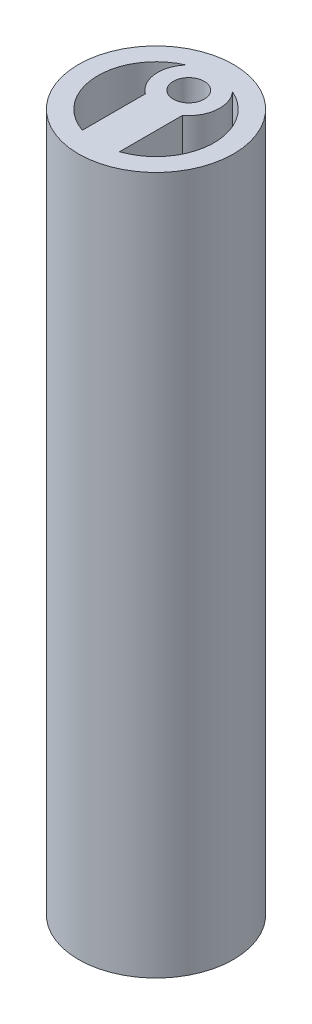
ISO-10303-21;
HEADER;
FILE_DESCRIPTION(('STEP AP214'),'2;1');
FILE_NAME('part.step','',(''),(''),'','','');
FILE_SCHEMA(('AUTOMOTIVE_DESIGN { 1 0 10303 214 1 1 1 1 }'));
ENDSEC;
DATA;
#1=APPLICATION_CONTEXT('core data for automotive mechanical design processes');
#2=APPLICATION_PROTOCOL_DEFINITION('international standard','automotive_design',2000,#1);
#3=PRODUCT_CONTEXT('',#1,'mechanical');
#4=PRODUCT('Part','Part','',(#3));
#5=PRODUCT_RELATED_PRODUCT_CATEGORY('part','',(#4));
#6=PRODUCT_DEFINITION_FORMATION('','',#4);
#7=PRODUCT_DEFINITION_CONTEXT('part definition',#1,'design');
#8=PRODUCT_DEFINITION('design','',#6,#7);
#9=PRODUCT_DEFINITION_SHAPE('','',#8);
#10=(LENGTH_UNIT() NAMED_UNIT(*) SI_UNIT(.MILLI.,.METRE.));
#11=(NAMED_UNIT(*) PLANE_ANGLE_UNIT() SI_UNIT($,.RADIAN.));
#12=(NAMED_UNIT(*) SI_UNIT($,.STERADIAN.) SOLID_ANGLE_UNIT());
#13=UNCERTAINTY_MEASURE_WITH_UNIT(LENGTH_MEASURE(1.E-05),#10,'distance_accuracy_value','');
#14=(GEOMETRIC_REPRESENTATION_CONTEXT(3) GLOBAL_UNCERTAINTY_ASSIGNED_CONTEXT((#13)) GLOBAL_UNIT_ASSIGNED_CONTEXT((#10,
#11,#12)) REPRESENTATION_CONTEXT('',''));
#15=CARTESIAN_POINT('',(0.,0.,0.));
#16=DIRECTION('',(0.,0.,1.));
#17=DIRECTION('',(1.,0.,0.));
#18=AXIS2_PLACEMENT_3D('',#15,#16,#17);
#19=CARTESIAN_POINT('',(0.,45.,0.));
#20=DIRECTION('',(0.,-1.,0.));
#21=DIRECTION('',(0.,0.,-1.));
#22=AXIS2_PLACEMENT_3D('',#19,#20,#21);
#23=CYLINDRICAL_SURFACE('',#22,3.75);
#24=DIRECTION('',(0.,1.,0.));
#25=VECTOR('',#24,1.);
#26=CARTESIAN_POINT('',(-1.49902151913111,22.5,-3.43735864948391));
#27=LINE('',#26,#25);
#28=CARTESIAN_POINT('',(-1.49902151913111,45.,-3.43735864948391));
#29=VERTEX_POINT('',#28);
#30=CARTESIAN_POINT('',(-1.49902151913111,0.,-3.43735864948391));
#31=VERTEX_POINT('',#30);
#32=EDGE_CURVE('E118',#29,#31,#27,.F.);
#33=ORIENTED_EDGE('',*,*,#32,.F.);
#34=CARTESIAN_POINT('',(0.,45.,0.));
#35=DIRECTION('',(0.,1.,0.));
#36=DIRECTION('',(0.,0.,1.));
#37=AXIS2_PLACEMENT_3D('',#34,#35,#36);
#38=CIRCLE('',#37,3.75);
#39=CARTESIAN_POINT('',(-1.2,45.,3.5528157846981));
#40=VERTEX_POINT('',#39);
#41=EDGE_CURVE('E124',#29,#40,#38,.T.);
#42=ORIENTED_EDGE('',*,*,#41,.T.);
#43=DIRECTION('',(0.,-1.,0.));
#44=VECTOR('',#43,1.);
#45=CARTESIAN_POINT('',(-1.2,45.,3.5528157846981));
#46=LINE('',#45,#44);
#47=CARTESIAN_POINT('',(-1.2,0.,3.5528157846981));
#48=VERTEX_POINT('',#47);
#49=EDGE_CURVE('E45',#48,#40,#46,.F.);
#50=ORIENTED_EDGE('',*,*,#49,.F.);
#51=CARTESIAN_POINT('',(0.,0.,0.));
#52=DIRECTION('',(0.,1.,0.));
#53=DIRECTION('',(0.,0.,1.));
#54=AXIS2_PLACEMENT_3D('',#51,#52,#53);
#55=CIRCLE('',#54,3.75);
#56=EDGE_CURVE('E60',#31,#48,#55,.T.);
#57=ORIENTED_EDGE('',*,*,#56,.F.);
#58=EDGE_LOOP('',(#33,#42,#50,#57));
#59=FACE_BOUND('',#58,.T.);
#60=ADVANCED_FACE('F37',(#59),#23,.F.);
#61=CARTESIAN_POINT('',(0.,45.,0.));
#62=DIRECTION('',(0.,1.,0.));
#63=DIRECTION('',(0.,0.,1.));
#64=AXIS2_PLACEMENT_3D('',#61,#62,#63);
#65=PLANE('',#64);
#66=CARTESIAN_POINT('',(0.,45.,-2.11337432737815));
#67=DIRECTION('',(0.,1.,0.));
#68=DIRECTION('',(0.,0.,1.));
#69=AXIS2_PLACEMENT_3D('',#66,#67,#68);
#70=CIRCLE('',#69,1.);
#71=CARTESIAN_POINT('',(0.,45.,-1.11337432737815));
#72=VERTEX_POINT('',#71);
#73=EDGE_CURVE('E176',#72,#72,#70,.T.);
#74=ORIENTED_EDGE('',*,*,#73,.F.);
#75=EDGE_LOOP('',(#74));
#76=FACE_BOUND('',#75,.T.);
#77=ORIENTED_EDGE('',*,*,#41,.F.);
#78=CARTESIAN_POINT('',(0.,45.,-2.11337432737815));
#79=DIRECTION('',(0.,1.,0.));
#80=DIRECTION('',(0.,0.,1.));
#81=AXIS2_PLACEMENT_3D('',#78,#79,#80);
#82=CIRCLE('',#81,2.);
#83=CARTESIAN_POINT('',(-1.2,45.,-0.513374327378152));
#84=VERTEX_POINT('',#83);
#85=EDGE_CURVE('E52',#29,#84,#82,.T.);
#86=ORIENTED_EDGE('',*,*,#85,.T.);
#87=DIRECTION('',(0.,0.,1.));
#88=VECTOR('',#87,1.);
#89=CARTESIAN_POINT('',(-1.2,45.,-4.35622350307341));
#90=LINE('',#89,#88);
#91=EDGE_CURVE('E115',#84,#40,#90,.T.);
#92=ORIENTED_EDGE('',*,*,#91,.T.);
#93=EDGE_LOOP('',(#77,#86,#92));
#94=FACE_BOUND('',#93,.T.);
#95=CARTESIAN_POINT('',(1.2,45.,-0.513374327378149));
#96=VERTEX_POINT('',#95);
#97=CARTESIAN_POINT('',(1.49902151913111,45.,-3.43735864948391));
#98=VERTEX_POINT('',#97);
#99=EDGE_CURVE('E91',#96,#98,#82,.T.);
#100=ORIENTED_EDGE('',*,*,#99,.T.);
#101=CARTESIAN_POINT('',(1.2,45.,3.5528157846981));
#102=VERTEX_POINT('',#101);
#103=EDGE_CURVE('E112',#102,#98,#38,.T.);
#104=ORIENTED_EDGE('',*,*,#103,.F.);
#105=DIRECTION('',(0.,0.,-1.));
#106=VECTOR('',#105,1.);
#107=CARTESIAN_POINT('',(1.2,45.,-4.35622350307341));
#108=LINE('',#107,#106);
#109=EDGE_CURVE('E107',#102,#96,#108,.T.);
#110=ORIENTED_EDGE('',*,*,#109,.T.);
#111=EDGE_LOOP('',(#100,#104,#110));
#112=FACE_BOUND('',#111,.T.);
#113=CARTESIAN_POINT('',(0.,45.,0.));
#114=DIRECTION('',(0.,1.,0.));
#115=DIRECTION('',(0.,0.,1.));
#116=AXIS2_PLACEMENT_3D('',#113,#114,#115);
#117=CIRCLE('',#116,5.);
#118=CARTESIAN_POINT('',(0.,45.,-5.));
#119=VERTEX_POINT('',#118);
#120=EDGE_CURVE('E128',#119,#119,#117,.T.);
#121=ORIENTED_EDGE('',*,*,#120,.T.);
#122=EDGE_LOOP('',(#121));
#123=FACE_BOUND('',#122,.T.);
#124=ADVANCED_FACE('F110',(#76,#94,#112,#123),#65,.T.);
#125=CARTESIAN_POINT('',(0.,0.,0.));
#126=DIRECTION('',(0.,1.,0.));
#127=DIRECTION('',(0.,0.,1.));
#128=AXIS2_PLACEMENT_3D('',#125,#126,#127);
#129=PLANE('',#128);
#130=CARTESIAN_POINT('',(0.,0.,-2.11337432737815));
#131=DIRECTION('',(0.,1.,0.));
#132=DIRECTION('',(0.,0.,1.));
#133=AXIS2_PLACEMENT_3D('',#130,#131,#132);
#134=CIRCLE('',#133,1.);
#135=CARTESIAN_POINT('',(0.,0.,-1.11337432737815));
#136=VERTEX_POINT('',#135);
#137=EDGE_CURVE('E174',#136,#136,#134,.T.);
#138=ORIENTED_EDGE('',*,*,#137,.T.);
#139=EDGE_LOOP('',(#138));
#140=FACE_BOUND('',#139,.T.);
#141=CARTESIAN_POINT('',(0.,0.,-2.11337432737815));
#142=DIRECTION('',(0.,1.,0.));
#143=DIRECTION('',(0.,0.,1.));
#144=AXIS2_PLACEMENT_3D('',#141,#142,#143);
#145=CIRCLE('',#144,2.);
#146=CARTESIAN_POINT('',(-1.2,0.,-0.513374327378152));
#147=VERTEX_POINT('',#146);
#148=EDGE_CURVE('E100',#31,#147,#145,.T.);
#149=ORIENTED_EDGE('',*,*,#148,.F.);
#150=ORIENTED_EDGE('',*,*,#56,.T.);
#151=DIRECTION('',(0.,0.,1.));
#152=VECTOR('',#151,1.);
#153=CARTESIAN_POINT('',(-1.2,0.,-4.35622350307341));
#154=LINE('',#153,#152);
#155=EDGE_CURVE('E114',#147,#48,#154,.T.);
#156=ORIENTED_EDGE('',*,*,#155,.F.);
#157=EDGE_LOOP('',(#149,#150,#156));
#158=FACE_BOUND('',#157,.T.);
#159=CARTESIAN_POINT('',(1.2,0.,3.5528157846981));
#160=VERTEX_POINT('',#159);
#161=CARTESIAN_POINT('',(1.49902151913111,0.,-3.43735864948391));
#162=VERTEX_POINT('',#161);
#163=EDGE_CURVE('E125',#160,#162,#55,.T.);
#164=ORIENTED_EDGE('',*,*,#163,.T.);
#165=CARTESIAN_POINT('',(1.2,0.,-0.513374327378149));
#166=VERTEX_POINT('',#165);
#167=EDGE_CURVE('E180',#166,#162,#145,.T.);
#168=ORIENTED_EDGE('',*,*,#167,.F.);
#169=DIRECTION('',(0.,0.,-1.));
#170=VECTOR('',#169,1.);
#171=CARTESIAN_POINT('',(1.2,0.,-4.35622350307341));
#172=LINE('',#171,#170);
#173=EDGE_CURVE('E109',#160,#166,#172,.T.);
#174=ORIENTED_EDGE('',*,*,#173,.F.);
#175=EDGE_LOOP('',(#164,#168,#174));
#176=FACE_BOUND('',#175,.T.);
#177=CARTESIAN_POINT('',(0.,0.,0.));
#178=DIRECTION('',(0.,1.,0.));
#179=DIRECTION('',(0.,0.,1.));
#180=AXIS2_PLACEMENT_3D('',#177,#178,#179);
#181=CIRCLE('',#180,5.);
#182=CARTESIAN_POINT('',(0.,0.,-5.));
#183=VERTEX_POINT('',#182);
#184=EDGE_CURVE('E123',#183,#183,#181,.T.);
#185=ORIENTED_EDGE('',*,*,#184,.F.);
#186=EDGE_LOOP('',(#185));
#187=FACE_BOUND('',#186,.T.);
#188=ADVANCED_FACE('F143',(#140,#158,#176,#187),#129,.F.);
#189=CARTESIAN_POINT('',(0.,45.,0.));
#190=DIRECTION('',(0.,-1.,0.));
#191=DIRECTION('',(0.,0.,-1.));
#192=AXIS2_PLACEMENT_3D('',#189,#190,#191);
#193=CYLINDRICAL_SURFACE('',#192,5.);
#194=CARTESIAN_POINT('',(0.,45.,-5.));
#195=CARTESIAN_POINT('',(0.,44.53125,-5.));
#196=CARTESIAN_POINT('',(0.,44.0625,-5.));
#197=CARTESIAN_POINT('',(0.,43.125,-5.));
#198=CARTESIAN_POINT('',(0.,42.65625,-5.));
#199=CARTESIAN_POINT('',(0.,41.71875,-5.));
#200=CARTESIAN_POINT('',(0.,41.25,-5.));
#201=CARTESIAN_POINT('',(0.,40.3125,-5.));
#202=CARTESIAN_POINT('',(0.,39.84375,-5.));
#203=CARTESIAN_POINT('',(0.,38.90625,-5.));
#204=CARTESIAN_POINT('',(0.,38.4375,-5.));
#205=CARTESIAN_POINT('',(0.,37.5,-5.));
#206=CARTESIAN_POINT('',(0.,37.03125,-5.));
#207=CARTESIAN_POINT('',(0.,36.09375,-5.));
#208=CARTESIAN_POINT('',(0.,35.625,-5.));
#209=CARTESIAN_POINT('',(0.,34.6875,-5.));
#210=CARTESIAN_POINT('',(0.,34.21875,-5.));
#211=CARTESIAN_POINT('',(0.,33.28125,-5.));
#212=CARTESIAN_POINT('',(0.,32.8125,-5.));
#213=CARTESIAN_POINT('',(0.,31.875,-5.));
#214=CARTESIAN_POINT('',(0.,31.40625,-5.));
#215=CARTESIAN_POINT('',(0.,30.46875,-5.));
#216=CARTESIAN_POINT('',(0.,30.,-5.));
#217=CARTESIAN_POINT('',(0.,29.0625,-5.));
#218=CARTESIAN_POINT('',(0.,28.59375,-5.));
#219=CARTESIAN_POINT('',(0.,27.65625,-5.));
#220=CARTESIAN_POINT('',(0.,27.1875,-5.));
#221=CARTESIAN_POINT('',(0.,26.25,-5.));
#222=CARTESIAN_POINT('',(0.,25.78125,-5.));
#223=CARTESIAN_POINT('',(0.,24.84375,-5.));
#224=CARTESIAN_POINT('',(0.,24.375,-5.));
#225=CARTESIAN_POINT('',(0.,23.4375,-5.));
#226=CARTESIAN_POINT('',(0.,22.96875,-5.));
#227=CARTESIAN_POINT('',(0.,22.03125,-5.));
#228=CARTESIAN_POINT('',(0.,21.5625,-5.));
#229=CARTESIAN_POINT('',(0.,20.625,-5.));
#230=CARTESIAN_POINT('',(0.,20.15625,-5.));
#231=CARTESIAN_POINT('',(0.,19.21875,-5.));
#232=CARTESIAN_POINT('',(0.,18.75,-5.));
#233=CARTESIAN_POINT('',(0.,17.8125,-5.));
#234=CARTESIAN_POINT('',(0.,17.34375,-5.));
#235=CARTESIAN_POINT('',(0.,16.40625,-5.));
#236=CARTESIAN_POINT('',(0.,15.9375,-5.));
#237=CARTESIAN_POINT('',(0.,15.,-5.));
#238=CARTESIAN_POINT('',(0.,14.53125,-5.));
#239=CARTESIAN_POINT('',(0.,13.59375,-5.));
#240=CARTESIAN_POINT('',(0.,13.125,-5.));
#241=CARTESIAN_POINT('',(0.,12.1875,-5.));
#242=CARTESIAN_POINT('',(0.,11.71875,-5.));
#243=CARTESIAN_POINT('',(0.,10.78125,-5.));
#244=CARTESIAN_POINT('',(0.,10.3125,-5.));
#245=CARTESIAN_POINT('',(0.,9.375,-5.));
#246=CARTESIAN_POINT('',(0.,8.90625,-5.));
#247=CARTESIAN_POINT('',(0.,7.96874999999999,-5.));
#248=CARTESIAN_POINT('',(0.,7.5,-5.));
#249=CARTESIAN_POINT('',(0.,6.5625,-5.));
#250=CARTESIAN_POINT('',(0.,6.09375,-5.));
#251=CARTESIAN_POINT('',(0.,5.15625,-5.));
#252=CARTESIAN_POINT('',(0.,4.68749999999999,-5.));
#253=CARTESIAN_POINT('',(0.,3.74999999999999,-5.));
#254=CARTESIAN_POINT('',(0.,3.28124999999999,-5.));
#255=CARTESIAN_POINT('',(0.,2.34374999999999,-5.));
#256=CARTESIAN_POINT('',(0.,1.87499999999999,-5.));
#257=CARTESIAN_POINT('',(0.,0.937499999999992,-5.));
#258=CARTESIAN_POINT('',(0.,0.468749999999993,-5.));
#259=CARTESIAN_POINT('',(0.,0.,-5.));
#260=B_SPLINE_CURVE_WITH_KNOTS('',3,(#194,#195,#196,#197,#198,#199,#200,#201,#202,#203,#204,
#205,#206,#207,#208,#209,#210,#211,#212,#213,#214,#215,#216,#217,#218,#219,#220,#221,#222,#223,
#224,#225,#226,#227,#228,#229,#230,#231,#232,#233,#234,#235,#236,#237,#238,#239,#240,#241,#242,
#243,#244,#245,#246,#247,#248,#249,#250,#251,#252,#253,#254,#255,#256,#257,#258,#259),
.UNSPECIFIED.,.F.,.F.,(4,2,2,2,2,2,2,2,2,2,2,2,2,2,2,2,2,2,2,2,2,2,2,2,2,2,2,2,2,2,2,2,4),(0.,
1.40625,2.8125,4.21875000000001,5.62500000000001,7.03125,8.4375,9.84375000000001,11.25,12.65625,
14.0625,15.46875,16.875,18.28125,19.6875,21.09375,22.5,23.90625,25.3125,26.71875,28.125,
29.53125,30.9375,32.34375,33.75,35.15625,36.5625,37.96875,39.375,40.78125,42.1875,43.59375,45.),.UNSPECIFIED.);
#261=EDGE_CURVE('BSEAM39',#119,#183,#260,.T.);
#262=ORIENTED_EDGE('',*,*,#120,.F.);
#263=ORIENTED_EDGE('',*,*,#184,.T.);
#264=ORIENTED_EDGE('',*,*,#261,.T.);
#265=ORIENTED_EDGE('',*,*,#261,.F.);
#266=EDGE_LOOP('',(#262,#264,#263,#265));
#267=FACE_BOUND('',#266,.T.);
#268=ADVANCED_FACE('F39',(#267),#193,.T.);
#269=DIRECTION('',(0.,1.,0.));
#270=VECTOR('',#269,1.);
#271=CARTESIAN_POINT('',(1.49902151913111,22.5,-3.43735864948391));
#272=LINE('',#271,#270);
#273=EDGE_CURVE('E96',#162,#98,#272,.T.);
#274=ORIENTED_EDGE('',*,*,#273,.F.);
#275=ORIENTED_EDGE('',*,*,#163,.F.);
#276=DIRECTION('',(0.,-1.,0.));
#277=VECTOR('',#276,1.);
#278=CARTESIAN_POINT('',(1.2,45.,3.5528157846981));
#279=LINE('',#278,#277);
#280=EDGE_CURVE('E131',#102,#160,#279,.T.);
#281=ORIENTED_EDGE('',*,*,#280,.F.);
#282=ORIENTED_EDGE('',*,*,#103,.T.);
#283=EDGE_LOOP('',(#274,#275,#281,#282));
#284=FACE_BOUND('',#283,.T.);
#285=ADVANCED_FACE('F152',(#284),#23,.F.);
#286=CARTESIAN_POINT('',(-1.2,0.,-4.35622350307341));
#287=DIRECTION('',(-1.,0.,0.));
#288=DIRECTION('',(0.,0.,1.));
#289=AXIS2_PLACEMENT_3D('',#286,#287,#288);
#290=PLANE('',#289);
#291=DIRECTION('',(0.,1.,0.));
#292=VECTOR('',#291,1.);
#293=CARTESIAN_POINT('',(-1.2,0.,-0.513374327378152));
#294=LINE('',#293,#292);
#295=EDGE_CURVE('E181',#147,#84,#294,.T.);
#296=ORIENTED_EDGE('',*,*,#295,.F.);
#297=ORIENTED_EDGE('',*,*,#155,.T.);
#298=ORIENTED_EDGE('',*,*,#49,.T.);
#299=ORIENTED_EDGE('',*,*,#91,.F.);
#300=EDGE_LOOP('',(#296,#297,#298,#299));
#301=FACE_BOUND('',#300,.T.);
#302=ADVANCED_FACE('F139',(#301),#290,.T.);
#303=CARTESIAN_POINT('',(1.2,0.,-4.35622350307341));
#304=DIRECTION('',(1.,0.,0.));
#305=DIRECTION('',(0.,0.,-1.));
#306=AXIS2_PLACEMENT_3D('',#303,#304,#305);
#307=PLANE('',#306);
#308=DIRECTION('',(0.,1.,0.));
#309=VECTOR('',#308,1.);
#310=CARTESIAN_POINT('',(1.2,0.,-0.51337432737815));
#311=LINE('',#310,#309);
#312=EDGE_CURVE('E11',#96,#166,#311,.F.);
#313=ORIENTED_EDGE('',*,*,#312,.F.);
#314=ORIENTED_EDGE('',*,*,#109,.F.);
#315=ORIENTED_EDGE('',*,*,#280,.T.);
#316=ORIENTED_EDGE('',*,*,#173,.T.);
#317=EDGE_LOOP('',(#313,#314,#315,#316));
#318=FACE_BOUND('',#317,.T.);
#319=ADVANCED_FACE('F105',(#318),#307,.T.);
#320=CARTESIAN_POINT('',(0.,0.,-2.11337432737815));
#321=DIRECTION('',(0.,1.,0.));
#322=DIRECTION('',(0.,0.,1.));
#323=AXIS2_PLACEMENT_3D('',#320,#321,#322);
#324=CYLINDRICAL_SURFACE('',#323,2.);
#325=ORIENTED_EDGE('',*,*,#167,.T.);
#326=ORIENTED_EDGE('',*,*,#273,.T.);
#327=ORIENTED_EDGE('',*,*,#99,.F.);
#328=ORIENTED_EDGE('',*,*,#312,.T.);
#329=EDGE_LOOP('',(#325,#326,#327,#328));
#330=FACE_BOUND('',#329,.T.);
#331=ADVANCED_FACE('F93',(#330),#324,.T.);
#332=ORIENTED_EDGE('',*,*,#85,.F.);
#333=ORIENTED_EDGE('',*,*,#32,.T.);
#334=ORIENTED_EDGE('',*,*,#148,.T.);
#335=ORIENTED_EDGE('',*,*,#295,.T.);
#336=EDGE_LOOP('',(#332,#333,#334,#335));
#337=FACE_BOUND('',#336,.T.);
#338=ADVANCED_FACE('F163',(#337),#324,.T.);
#339=CARTESIAN_POINT('',(0.,0.,-2.11337432737815));
#340=DIRECTION('',(0.,1.,0.));
#341=DIRECTION('',(0.,0.,1.));
#342=AXIS2_PLACEMENT_3D('',#339,#340,#341);
#343=CYLINDRICAL_SURFACE('',#342,1.);
#344=CARTESIAN_POINT('',(0.,0.,-1.11337432737815));
#345=CARTESIAN_POINT('',(0.,0.468749999999999,-1.11337432737815));
#346=CARTESIAN_POINT('',(0.,0.9375,-1.11337432737815));
#347=CARTESIAN_POINT('',(0.,1.875,-1.11337432737815));
#348=CARTESIAN_POINT('',(0.,2.34375,-1.11337432737815));
#349=CARTESIAN_POINT('',(0.,3.28125,-1.11337432737815));
#350=CARTESIAN_POINT('',(0.,3.75,-1.11337432737815));
#351=CARTESIAN_POINT('',(0.,4.6875,-1.11337432737815));
#352=CARTESIAN_POINT('',(0.,5.15625,-1.11337432737815));
#353=CARTESIAN_POINT('',(0.,6.09375,-1.11337432737815));
#354=CARTESIAN_POINT('',(0.,6.5625,-1.11337432737815));
#355=CARTESIAN_POINT('',(0.,7.5,-1.11337432737815));
#356=CARTESIAN_POINT('',(0.,7.96875,-1.11337432737815));
#357=CARTESIAN_POINT('',(0.,8.90625,-1.11337432737815));
#358=CARTESIAN_POINT('',(0.,9.375,-1.11337432737815));
#359=CARTESIAN_POINT('',(0.,10.3125,-1.11337432737815));
#360=CARTESIAN_POINT('',(0.,10.78125,-1.11337432737815));
#361=CARTESIAN_POINT('',(0.,11.71875,-1.11337432737815));
#362=CARTESIAN_POINT('',(0.,12.1875,-1.11337432737815));
#363=CARTESIAN_POINT('',(0.,13.125,-1.11337432737815));
#364=CARTESIAN_POINT('',(0.,13.59375,-1.11337432737815));
#365=CARTESIAN_POINT('',(0.,14.53125,-1.11337432737815));
#366=CARTESIAN_POINT('',(0.,15.,-1.11337432737815));
#367=CARTESIAN_POINT('',(0.,15.9375,-1.11337432737815));
#368=CARTESIAN_POINT('',(0.,16.40625,-1.11337432737815));
#369=CARTESIAN_POINT('',(0.,17.34375,-1.11337432737815));
#370=CARTESIAN_POINT('',(0.,17.8125,-1.11337432737815));
#371=CARTESIAN_POINT('',(0.,18.75,-1.11337432737815));
#372=CARTESIAN_POINT('',(0.,19.21875,-1.11337432737815));
#373=CARTESIAN_POINT('',(0.,20.15625,-1.11337432737815));
#374=CARTESIAN_POINT('',(0.,20.625,-1.11337432737815));
#375=CARTESIAN_POINT('',(0.,21.5625,-1.11337432737815));
#376=CARTESIAN_POINT('',(0.,22.03125,-1.11337432737815));
#377=CARTESIAN_POINT('',(0.,22.96875,-1.11337432737815));
#378=CARTESIAN_POINT('',(0.,23.4375,-1.11337432737815));
#379=CARTESIAN_POINT('',(0.,24.375,-1.11337432737815));
#380=CARTESIAN_POINT('',(0.,24.84375,-1.11337432737815));
#381=CARTESIAN_POINT('',(0.,25.78125,-1.11337432737815));
#382=CARTESIAN_POINT('',(0.,26.25,-1.11337432737815));
#383=CARTESIAN_POINT('',(0.,27.1875,-1.11337432737815));
#384=CARTESIAN_POINT('',(0.,27.65625,-1.11337432737815));
#385=CARTESIAN_POINT('',(0.,28.59375,-1.11337432737815));
#386=CARTESIAN_POINT('',(0.,29.0625,-1.11337432737815));
#387=CARTESIAN_POINT('',(0.,30.,-1.11337432737815));
#388=CARTESIAN_POINT('',(0.,30.46875,-1.11337432737815));
#389=CARTESIAN_POINT('',(0.,31.40625,-1.11337432737815));
#390=CARTESIAN_POINT('',(0.,31.875,-1.11337432737815));
#391=CARTESIAN_POINT('',(0.,32.8125,-1.11337432737815));
#392=CARTESIAN_POINT('',(0.,33.28125,-1.11337432737815));
#393=CARTESIAN_POINT('',(0.,34.21875,-1.11337432737815));
#394=CARTESIAN_POINT('',(0.,34.6875,-1.11337432737815));
#395=CARTESIAN_POINT('',(0.,35.625,-1.11337432737815));
#396=CARTESIAN_POINT('',(0.,36.09375,-1.11337432737815));
#397=CARTESIAN_POINT('',(0.,37.03125,-1.11337432737815));
#398=CARTESIAN_POINT('',(0.,37.5,-1.11337432737815));
#399=CARTESIAN_POINT('',(0.,38.4375,-1.11337432737815));
#400=CARTESIAN_POINT('',(0.,38.90625,-1.11337432737815));
#401=CARTESIAN_POINT('',(0.,39.84375,-1.11337432737815));
#402=CARTESIAN_POINT('',(0.,40.3125,-1.11337432737815));
#403=CARTESIAN_POINT('',(0.,41.25,-1.11337432737815));
#404=CARTESIAN_POINT('',(0.,41.71875,-1.11337432737815));
#405=CARTESIAN_POINT('',(0.,42.65625,-1.11337432737815));
#406=CARTESIAN_POINT('',(0.,43.125,-1.11337432737815));
#407=CARTESIAN_POINT('',(0.,44.0625,-1.11337432737815));
#408=CARTESIAN_POINT('',(0.,44.53125,-1.11337432737815));
#409=CARTESIAN_POINT('',(0.,45.,-1.11337432737815));
#410=B_SPLINE_CURVE_WITH_KNOTS('',3,(#344,#345,#346,#347,#348,#349,#350,#351,#352,#353,#354,
#355,#356,#357,#358,#359,#360,#361,#362,#363,#364,#365,#366,#367,#368,#369,#370,#371,#372,#373,
#374,#375,#376,#377,#378,#379,#380,#381,#382,#383,#384,#385,#386,#387,#388,#389,#390,#391,#392,
#393,#394,#395,#396,#397,#398,#399,#400,#401,#402,#403,#404,#405,#406,#407,#408,#409),
.UNSPECIFIED.,.F.,.F.,(4,2,2,2,2,2,2,2,2,2,2,2,2,2,2,2,2,2,2,2,2,2,2,2,2,2,2,2,2,2,2,2,4),(0.,
1.40625,2.8125,4.21875,5.625,7.03125,8.4375,9.84375,11.25,12.65625,14.0625,15.46875,16.875,
18.28125,19.6875,21.09375,22.5,23.90625,25.3125,26.71875,28.125,29.53125,30.9375,32.34375,33.75,
35.15625,36.5625,37.96875,39.375,40.78125,42.1875,43.59375,45.),.UNSPECIFIED.);
#411=EDGE_CURVE('BSEAM164',#136,#72,#410,.T.);
#412=ORIENTED_EDGE('',*,*,#137,.F.);
#413=ORIENTED_EDGE('',*,*,#73,.T.);
#414=ORIENTED_EDGE('',*,*,#411,.T.);
#415=ORIENTED_EDGE('',*,*,#411,.F.);
#416=EDGE_LOOP('',(#412,#414,#413,#415));
#417=FACE_BOUND('',#416,.T.);
#418=ADVANCED_FACE('F164',(#417),#343,.F.);
#419=CLOSED_SHELL('',(#60,#124,#188,#268,#285,#302,#319,#331,#338,#418));
#420=MANIFOLD_SOLID_BREP('B2',#419);
#421=ADVANCED_BREP_SHAPE_REPRESENTATION('',(#18,#420),#14);
#422=SHAPE_DEFINITION_REPRESENTATION(#9,#421);
ENDSEC;
END-ISO-10303-21;
